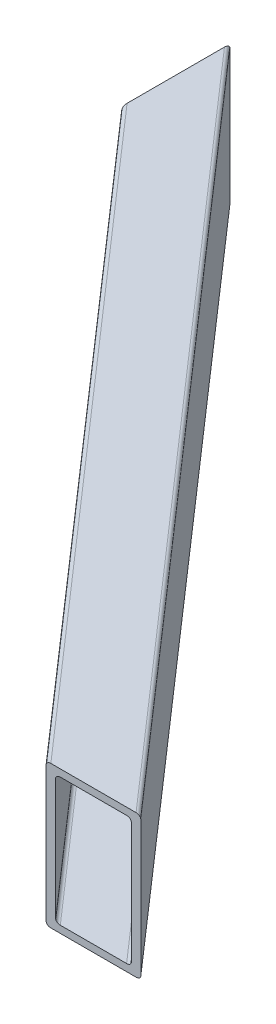
ISO-10303-21;
HEADER;
FILE_DESCRIPTION(('STEP AP214'),'2;1');
FILE_NAME('part.step','',(''),(''),'','','');
FILE_SCHEMA(('AUTOMOTIVE_DESIGN { 1 0 10303 214 1 1 1 1 }'));
ENDSEC;
DATA;
#1=APPLICATION_CONTEXT('core data for automotive mechanical design processes');
#2=APPLICATION_PROTOCOL_DEFINITION('international standard','automotive_design',2000,#1);
#3=PRODUCT_CONTEXT('',#1,'mechanical');
#4=PRODUCT('Part','Part','',(#3));
#5=PRODUCT_RELATED_PRODUCT_CATEGORY('part','',(#4));
#6=PRODUCT_DEFINITION_FORMATION('','',#4);
#7=PRODUCT_DEFINITION_CONTEXT('part definition',#1,'design');
#8=PRODUCT_DEFINITION('design','',#6,#7);
#9=PRODUCT_DEFINITION_SHAPE('','',#8);
#10=(LENGTH_UNIT() NAMED_UNIT(*) SI_UNIT(.MILLI.,.METRE.));
#11=(NAMED_UNIT(*) PLANE_ANGLE_UNIT() SI_UNIT($,.RADIAN.));
#12=(NAMED_UNIT(*) SI_UNIT($,.STERADIAN.) SOLID_ANGLE_UNIT());
#13=UNCERTAINTY_MEASURE_WITH_UNIT(LENGTH_MEASURE(1.E-05),#10,'distance_accuracy_value','');
#14=(GEOMETRIC_REPRESENTATION_CONTEXT(3) GLOBAL_UNCERTAINTY_ASSIGNED_CONTEXT((#13)) GLOBAL_UNIT_ASSIGNED_CONTEXT((#10,
#11,#12)) REPRESENTATION_CONTEXT('',''));
#15=CARTESIAN_POINT('',(0.,0.,0.));
#16=DIRECTION('',(0.,0.,1.));
#17=DIRECTION('',(1.,0.,0.));
#18=AXIS2_PLACEMENT_3D('',#15,#16,#17);
#19=CARTESIAN_POINT('',(0.,80.,-339.256309641516));
#20=DIRECTION('',(1.,0.,0.));
#21=DIRECTION('',(0.,0.,-1.));
#22=AXIS2_PLACEMENT_3D('',#19,#20,#21);
#23=PLANE('',#22);
#24=DIRECTION('',(0.,0.,-1.));
#25=VECTOR('',#24,1.);
#26=CARTESIAN_POINT('',(0.,4.,-339.256309641516));
#27=LINE('',#26,#25);
#28=CARTESIAN_POINT('',(0.,4.,-348.367863195289));
#29=VERTEX_POINT('',#28);
#30=CARTESIAN_POINT('',(0.,4.,-390.888446446227));
#31=VERTEX_POINT('',#30);
#32=EDGE_CURVE('E254',#29,#31,#27,.T.);
#33=ORIENTED_EDGE('',*,*,#32,.T.);
#34=CARTESIAN_POINT('',(0.,6.,-390.888446446227));
#35=DIRECTION('',(1.,0.,0.));
#36=DIRECTION('',(0.,0.,-1.));
#37=AXIS2_PLACEMENT_3D('',#34,#35,#36);
#38=ELLIPSE('',#37,3.03718451792419,2.);
#39=CARTESIAN_POINT('',(0.,6.00000000000001,-393.925630964152));
#40=VERTEX_POINT('',#39);
#41=EDGE_CURVE('E43',#31,#40,#38,.T.);
#42=ORIENTED_EDGE('',*,*,#41,.T.);
#43=DIRECTION('',(0.,1.,0.));
#44=VECTOR('',#43,1.);
#45=CARTESIAN_POINT('',(0.,80.,-393.925630964152));
#46=LINE('',#45,#44);
#47=CARTESIAN_POINT('',(0.,74.,-393.925630964152));
#48=VERTEX_POINT('',#47);
#49=EDGE_CURVE('E252',#40,#48,#46,.T.);
#50=ORIENTED_EDGE('',*,*,#49,.T.);
#51=CARTESIAN_POINT('',(0.,74.,-390.888446446227));
#52=DIRECTION('',(1.,0.,0.));
#53=DIRECTION('',(0.,0.,1.));
#54=AXIS2_PLACEMENT_3D('',#51,#52,#53);
#55=ELLIPSE('',#54,3.03718451792419,2.);
#56=CARTESIAN_POINT('',(0.,76.,-390.888446446227));
#57=VERTEX_POINT('',#56);
#58=EDGE_CURVE('E237',#48,#57,#55,.T.);
#59=ORIENTED_EDGE('',*,*,#58,.T.);
#60=DIRECTION('',(0.,0.,1.));
#61=VECTOR('',#60,1.);
#62=CARTESIAN_POINT('',(0.,76.,-339.256309641516));
#63=LINE('',#62,#61);
#64=CARTESIAN_POINT('',(0.,76.,-348.367863195289));
#65=VERTEX_POINT('',#64);
#66=EDGE_CURVE('E179',#57,#65,#63,.T.);
#67=ORIENTED_EDGE('',*,*,#66,.T.);
#68=CARTESIAN_POINT('',(0.,74.,-348.367863195289));
#69=DIRECTION('',(1.,0.,0.));
#70=DIRECTION('',(0.,0.,-1.));
#71=AXIS2_PLACEMENT_3D('',#68,#69,#70);
#72=ELLIPSE('',#71,3.03718451792418,2.);
#73=CARTESIAN_POINT('',(0.,74.,-345.330678677365));
#74=VERTEX_POINT('',#73);
#75=EDGE_CURVE('E243',#65,#74,#72,.T.);
#76=ORIENTED_EDGE('',*,*,#75,.T.);
#77=DIRECTION('',(0.,-1.,0.));
#78=VECTOR('',#77,1.);
#79=CARTESIAN_POINT('',(0.,80.,-345.330678677365));
#80=LINE('',#79,#78);
#81=CARTESIAN_POINT('',(0.,6.00000000000001,-345.330678677365));
#82=VERTEX_POINT('',#81);
#83=EDGE_CURVE('E277',#74,#82,#80,.T.);
#84=ORIENTED_EDGE('',*,*,#83,.T.);
#85=CARTESIAN_POINT('',(0.,6.,-348.367863195289));
#86=DIRECTION('',(1.,0.,0.));
#87=DIRECTION('',(0.,0.,1.));
#88=AXIS2_PLACEMENT_3D('',#85,#86,#87);
#89=ELLIPSE('',#88,3.03718451792418,2.);
#90=EDGE_CURVE('E247',#82,#29,#89,.T.);
#91=ORIENTED_EDGE('',*,*,#90,.T.);
#92=EDGE_LOOP('',(#33,#42,#50,#59,#67,#76,#84,#91));
#93=FACE_BOUND('',#92,.T.);
#94=DIRECTION('',(0.,-1.,0.));
#95=VECTOR('',#94,1.);
#96=CARTESIAN_POINT('',(0.,80.,-339.256309641516));
#97=LINE('',#96,#95);
#98=CARTESIAN_POINT('',(0.,78.,-339.256309641516));
#99=VERTEX_POINT('',#98);
#100=CARTESIAN_POINT('',(0.,2.,-339.256309641516));
#101=VERTEX_POINT('',#100);
#102=EDGE_CURVE('E167',#99,#101,#97,.T.);
#103=ORIENTED_EDGE('',*,*,#102,.F.);
#104=CARTESIAN_POINT('',(0.,78.,-342.29349415944));
#105=DIRECTION('',(1.,0.,0.));
#106=DIRECTION('',(0.,0.,1.));
#107=AXIS2_PLACEMENT_3D('',#104,#105,#106);
#108=ELLIPSE('',#107,3.03718451792418,2.);
#109=CARTESIAN_POINT('',(0.,80.,-342.29349415944));
#110=VERTEX_POINT('',#109);
#111=EDGE_CURVE('E154',#99,#110,#108,.F.);
#112=ORIENTED_EDGE('',*,*,#111,.T.);
#113=DIRECTION('',(0.,0.,1.));
#114=VECTOR('',#113,1.);
#115=CARTESIAN_POINT('',(0.,80.,-339.256309641516));
#116=LINE('',#115,#114);
#117=CARTESIAN_POINT('',(0.,80.,-396.962815482076));
#118=VERTEX_POINT('',#117);
#119=EDGE_CURVE('E162',#118,#110,#116,.T.);
#120=ORIENTED_EDGE('',*,*,#119,.F.);
#121=CARTESIAN_POINT('',(0.,78.,-396.962815482076));
#122=DIRECTION('',(1.,0.,0.));
#123=DIRECTION('',(0.,0.,-1.));
#124=AXIS2_PLACEMENT_3D('',#121,#122,#123);
#125=ELLIPSE('',#124,3.03718451792419,2.);
#126=CARTESIAN_POINT('',(0.,78.,-400.));
#127=VERTEX_POINT('',#126);
#128=EDGE_CURVE('E58',#118,#127,#125,.F.);
#129=ORIENTED_EDGE('',*,*,#128,.T.);
#130=DIRECTION('',(0.,-1.,0.));
#131=VECTOR('',#130,1.);
#132=CARTESIAN_POINT('',(0.,80.,-400.));
#133=LINE('',#132,#131);
#134=CARTESIAN_POINT('',(0.,2.,-400.));
#135=VERTEX_POINT('',#134);
#136=EDGE_CURVE('E173',#127,#135,#133,.T.);
#137=ORIENTED_EDGE('',*,*,#136,.T.);
#138=CARTESIAN_POINT('',(0.,2.,-396.962815482076));
#139=DIRECTION('',(1.,0.,0.));
#140=DIRECTION('',(0.,0.,1.));
#141=AXIS2_PLACEMENT_3D('',#138,#139,#140);
#142=ELLIPSE('',#141,3.03718451792419,2.);
#143=CARTESIAN_POINT('',(0.,0.,-396.962815482076));
#144=VERTEX_POINT('',#143);
#145=EDGE_CURVE('E50',#135,#144,#142,.F.);
#146=ORIENTED_EDGE('',*,*,#145,.T.);
#147=DIRECTION('',(0.,0.,1.));
#148=VECTOR('',#147,1.);
#149=CARTESIAN_POINT('',(0.,0.,-339.256309641516));
#150=LINE('',#149,#148);
#151=CARTESIAN_POINT('',(0.,0.,-342.29349415944));
#152=VERTEX_POINT('',#151);
#153=EDGE_CURVE('E176',#144,#152,#150,.T.);
#154=ORIENTED_EDGE('',*,*,#153,.T.);
#155=CARTESIAN_POINT('',(0.,2.,-342.29349415944));
#156=DIRECTION('',(1.,0.,0.));
#157=DIRECTION('',(0.,0.,-1.));
#158=AXIS2_PLACEMENT_3D('',#155,#156,#157);
#159=ELLIPSE('',#158,3.03718451792418,2.);
#160=EDGE_CURVE('E155',#152,#101,#159,.F.);
#161=ORIENTED_EDGE('',*,*,#160,.T.);
#162=EDGE_LOOP('',(#103,#112,#120,#129,#137,#146,#154,#161));
#163=FACE_BOUND('',#162,.T.);
#164=ADVANCED_FACE('F35',(#93,#163),#23,.F.);
#165=CARTESIAN_POINT('',(0.,80.,-339.256309641516));
#166=DIRECTION('',(0.752576694706878,0.,-0.658504607868518));
#167=DIRECTION('',(-0.658504607868518,0.,-0.752576694706878));
#168=AXIS2_PLACEMENT_3D('',#165,#166,#167);
#169=PLANE('',#168);
#170=DIRECTION('',(0.,-1.,0.));
#171=VECTOR('',#170,1.);
#172=CARTESIAN_POINT('',(296.849270936327,80.,0.));
#173=LINE('',#172,#171);
#174=CARTESIAN_POINT('',(296.849270936327,78.,0.));
#175=VERTEX_POINT('',#174);
#176=CARTESIAN_POINT('',(296.849270936327,2.,0.));
#177=VERTEX_POINT('',#176);
#178=EDGE_CURVE('E188',#175,#177,#173,.T.);
#179=ORIENTED_EDGE('',*,*,#178,.F.);
#180=DIRECTION('',(0.658504607868518,0.,0.752576694706878));
#181=VECTOR('',#180,1.);
#182=CARTESIAN_POINT('',(0.,78.,-339.256309641516));
#183=LINE('',#182,#181);
#184=EDGE_CURVE('E205',#175,#99,#183,.F.);
#185=ORIENTED_EDGE('',*,*,#184,.T.);
#186=ORIENTED_EDGE('',*,*,#102,.T.);
#187=DIRECTION('',(0.658504607868518,0.,0.752576694706878));
#188=VECTOR('',#187,1.);
#189=CARTESIAN_POINT('',(296.849270936327,2.,1.48039438822342E-13));
#190=LINE('',#189,#188);
#191=EDGE_CURVE('E202',#101,#177,#190,.T.);
#192=ORIENTED_EDGE('',*,*,#191,.T.);
#193=EDGE_LOOP('',(#179,#185,#186,#192));
#194=FACE_BOUND('',#193,.T.);
#195=ADVANCED_FACE('F316',(#194),#169,.F.);
#196=CARTESIAN_POINT('',(296.849270936327,80.,0.));
#197=DIRECTION('',(0.,0.,-1.));
#198=DIRECTION('',(-1.,0.,0.));
#199=AXIS2_PLACEMENT_3D('',#196,#197,#198);
#200=PLANE('',#199);
#201=DIRECTION('',(-1.,0.,0.));
#202=VECTOR('',#201,1.);
#203=CARTESIAN_POINT('',(296.849270936327,4.,0.));
#204=LINE('',#203,#202);
#205=CARTESIAN_POINT('',(342.027390640449,4.,0.));
#206=VERTEX_POINT('',#205);
#207=CARTESIAN_POINT('',(304.821880295878,4.,0.));
#208=VERTEX_POINT('',#207);
#209=EDGE_CURVE('E273',#206,#208,#204,.T.);
#210=ORIENTED_EDGE('',*,*,#209,.T.);
#211=CARTESIAN_POINT('',(304.821880295878,6.,0.));
#212=DIRECTION('',(0.,0.,-1.));
#213=DIRECTION('',(1.,0.,0.));
#214=AXIS2_PLACEMENT_3D('',#211,#212,#213);
#215=ELLIPSE('',#214,2.65753645318366,2.);
#216=CARTESIAN_POINT('',(302.164343842694,6.00000000000001,0.));
#217=VERTEX_POINT('',#216);
#218=EDGE_CURVE('E245',#208,#217,#215,.T.);
#219=ORIENTED_EDGE('',*,*,#218,.T.);
#220=DIRECTION('',(0.,1.,0.));
#221=VECTOR('',#220,1.);
#222=CARTESIAN_POINT('',(302.164343842694,80.,0.));
#223=LINE('',#222,#221);
#224=CARTESIAN_POINT('',(302.164343842694,74.,0.));
#225=VERTEX_POINT('',#224);
#226=EDGE_CURVE('E263',#217,#225,#223,.T.);
#227=ORIENTED_EDGE('',*,*,#226,.T.);
#228=CARTESIAN_POINT('',(304.821880295878,74.,0.));
#229=DIRECTION('',(0.,0.,-1.));
#230=DIRECTION('',(-1.,0.,0.));
#231=AXIS2_PLACEMENT_3D('',#228,#229,#230);
#232=ELLIPSE('',#231,2.65753645318366,2.);
#233=CARTESIAN_POINT('',(304.821880295878,76.,0.));
#234=VERTEX_POINT('',#233);
#235=EDGE_CURVE('E241',#225,#234,#232,.T.);
#236=ORIENTED_EDGE('',*,*,#235,.T.);
#237=DIRECTION('',(1.,0.,0.));
#238=VECTOR('',#237,1.);
#239=CARTESIAN_POINT('',(296.849270936327,76.,0.));
#240=LINE('',#239,#238);
#241=CARTESIAN_POINT('',(342.027390640449,76.,0.));
#242=VERTEX_POINT('',#241);
#243=EDGE_CURVE('E279',#234,#242,#240,.T.);
#244=ORIENTED_EDGE('',*,*,#243,.T.);
#245=CARTESIAN_POINT('',(342.027390640449,74.,0.));
#246=DIRECTION('',(0.,0.,-1.));
#247=DIRECTION('',(1.,0.,0.));
#248=AXIS2_PLACEMENT_3D('',#245,#246,#247);
#249=ELLIPSE('',#248,2.65753645318366,2.);
#250=CARTESIAN_POINT('',(344.684927093633,74.,0.));
#251=VERTEX_POINT('',#250);
#252=EDGE_CURVE('E239',#242,#251,#249,.T.);
#253=ORIENTED_EDGE('',*,*,#252,.T.);
#254=DIRECTION('',(0.,-1.,0.));
#255=VECTOR('',#254,1.);
#256=CARTESIAN_POINT('',(344.684927093633,80.,0.));
#257=LINE('',#256,#255);
#258=CARTESIAN_POINT('',(344.684927093633,6.00000000000001,0.));
#259=VERTEX_POINT('',#258);
#260=EDGE_CURVE('E264',#251,#259,#257,.T.);
#261=ORIENTED_EDGE('',*,*,#260,.T.);
#262=CARTESIAN_POINT('',(342.027390640449,6.,0.));
#263=DIRECTION('',(0.,0.,-1.));
#264=DIRECTION('',(-1.,0.,0.));
#265=AXIS2_PLACEMENT_3D('',#262,#263,#264);
#266=ELLIPSE('',#265,2.65753645318366,2.);
#267=EDGE_CURVE('E11',#259,#206,#266,.T.);
#268=ORIENTED_EDGE('',*,*,#267,.T.);
#269=EDGE_LOOP('',(#210,#219,#227,#236,#244,#253,#261,#268));
#270=FACE_BOUND('',#269,.T.);
#271=DIRECTION('',(1.,0.,0.));
#272=VECTOR('',#271,1.);
#273=CARTESIAN_POINT('',(296.849270936327,80.,0.));
#274=LINE('',#273,#272);
#275=CARTESIAN_POINT('',(299.50680738951,80.,0.));
#276=VERTEX_POINT('',#275);
#277=CARTESIAN_POINT('',(347.342463546816,80.,0.));
#278=VERTEX_POINT('',#277);
#279=EDGE_CURVE('E165',#276,#278,#274,.T.);
#280=ORIENTED_EDGE('',*,*,#279,.F.);
#281=CARTESIAN_POINT('',(299.50680738951,78.,0.));
#282=DIRECTION('',(0.,0.,-1.));
#283=DIRECTION('',(1.,0.,0.));
#284=AXIS2_PLACEMENT_3D('',#281,#282,#283);
#285=ELLIPSE('',#284,2.65753645318366,2.);
#286=EDGE_CURVE('E200',#276,#175,#285,.F.);
#287=ORIENTED_EDGE('',*,*,#286,.T.);
#288=ORIENTED_EDGE('',*,*,#178,.T.);
#289=CARTESIAN_POINT('',(299.50680738951,2.,0.));
#290=DIRECTION('',(0.,0.,-1.));
#291=DIRECTION('',(-1.,0.,0.));
#292=AXIS2_PLACEMENT_3D('',#289,#290,#291);
#293=ELLIPSE('',#292,2.65753645318366,2.);
#294=CARTESIAN_POINT('',(299.50680738951,0.,0.));
#295=VERTEX_POINT('',#294);
#296=EDGE_CURVE('E196',#177,#295,#293,.F.);
#297=ORIENTED_EDGE('',*,*,#296,.T.);
#298=DIRECTION('',(1.,0.,0.));
#299=VECTOR('',#298,1.);
#300=CARTESIAN_POINT('',(296.849270936327,0.,0.));
#301=LINE('',#300,#299);
#302=CARTESIAN_POINT('',(347.342463546816,0.,0.));
#303=VERTEX_POINT('',#302);
#304=EDGE_CURVE('E171',#295,#303,#301,.T.);
#305=ORIENTED_EDGE('',*,*,#304,.T.);
#306=CARTESIAN_POINT('',(347.342463546816,2.,0.));
#307=DIRECTION('',(0.,0.,-1.));
#308=DIRECTION('',(1.,0.,0.));
#309=AXIS2_PLACEMENT_3D('',#306,#307,#308);
#310=ELLIPSE('',#309,2.65753645318366,2.);
#311=CARTESIAN_POINT('',(350.,2.,0.));
#312=VERTEX_POINT('',#311);
#313=EDGE_CURVE('E194',#303,#312,#310,.F.);
#314=ORIENTED_EDGE('',*,*,#313,.T.);
#315=DIRECTION('',(0.,-1.,0.));
#316=VECTOR('',#315,1.);
#317=CARTESIAN_POINT('',(350.,80.,0.));
#318=LINE('',#317,#316);
#319=CARTESIAN_POINT('',(350.,78.,0.));
#320=VERTEX_POINT('',#319);
#321=EDGE_CURVE('E185',#320,#312,#318,.T.);
#322=ORIENTED_EDGE('',*,*,#321,.F.);
#323=CARTESIAN_POINT('',(347.342463546816,78.,0.));
#324=DIRECTION('',(0.,0.,-1.));
#325=DIRECTION('',(-1.,0.,0.));
#326=AXIS2_PLACEMENT_3D('',#323,#324,#325);
#327=ELLIPSE('',#326,2.65753645318366,2.);
#328=EDGE_CURVE('E198',#320,#278,#327,.F.);
#329=ORIENTED_EDGE('',*,*,#328,.T.);
#330=EDGE_LOOP('',(#280,#287,#288,#297,#305,#314,#322,#329));
#331=FACE_BOUND('',#330,.T.);
#332=ADVANCED_FACE('F271',(#270,#331),#200,.F.);
#333=CARTESIAN_POINT('',(350.,80.,0.));
#334=DIRECTION('',(-0.752576694706878,0.,0.658504607868518));
#335=DIRECTION('',(0.658504607868518,0.,0.752576694706878));
#336=AXIS2_PLACEMENT_3D('',#333,#334,#335);
#337=PLANE('',#336);
#338=ORIENTED_EDGE('',*,*,#136,.F.);
#339=DIRECTION('',(-0.658504607868518,0.,-0.752576694706878));
#340=VECTOR('',#339,1.);
#341=CARTESIAN_POINT('',(350.,78.,0.));
#342=LINE('',#341,#340);
#343=EDGE_CURVE('E153',#127,#320,#342,.F.);
#344=ORIENTED_EDGE('',*,*,#343,.T.);
#345=ORIENTED_EDGE('',*,*,#321,.T.);
#346=DIRECTION('',(-0.658504607868518,0.,-0.752576694706878));
#347=VECTOR('',#346,1.);
#348=CARTESIAN_POINT('',(0.,2.,-400.));
#349=LINE('',#348,#347);
#350=EDGE_CURVE('E230',#312,#135,#349,.T.);
#351=ORIENTED_EDGE('',*,*,#350,.T.);
#352=EDGE_LOOP('',(#338,#344,#345,#351));
#353=FACE_BOUND('',#352,.T.);
#354=ADVANCED_FACE('F391',(#353),#337,.F.);
#355=CARTESIAN_POINT('',(0.,80.,0.));
#356=DIRECTION('',(0.,-1.,0.));
#357=DIRECTION('',(0.,0.,-1.));
#358=AXIS2_PLACEMENT_3D('',#355,#356,#357);
#359=PLANE('',#358);
#360=ORIENTED_EDGE('',*,*,#119,.T.);
#361=DIRECTION('',(0.658504607868518,0.,0.752576694706878));
#362=VECTOR('',#361,1.);
#363=CARTESIAN_POINT('',(169.632174096714,80.,-148.428152334625));
#364=LINE('',#363,#362);
#365=EDGE_CURVE('E166',#110,#276,#364,.T.);
#366=ORIENTED_EDGE('',*,*,#365,.T.);
#367=ORIENTED_EDGE('',*,*,#279,.T.);
#368=DIRECTION('',(-0.658504607868518,0.,-0.752576694706878));
#369=VECTOR('',#368,1.);
#370=CARTESIAN_POINT('',(196.724935106161,80.,-172.134318217891));
#371=LINE('',#370,#369);
#372=EDGE_CURVE('E152',#278,#118,#371,.T.);
#373=ORIENTED_EDGE('',*,*,#372,.T.);
#374=EDGE_LOOP('',(#360,#366,#367,#373));
#375=FACE_BOUND('',#374,.T.);
#376=ADVANCED_FACE('F160',(#375),#359,.F.);
#377=CARTESIAN_POINT('',(0.,0.,0.));
#378=DIRECTION('',(0.,-1.,0.));
#379=DIRECTION('',(0.,0.,-1.));
#380=AXIS2_PLACEMENT_3D('',#377,#378,#379);
#381=PLANE('',#380);
#382=ORIENTED_EDGE('',*,*,#304,.F.);
#383=DIRECTION('',(0.658504607868518,0.,0.752576694706878));
#384=VECTOR('',#383,1.);
#385=CARTESIAN_POINT('',(1.50515338941375,0.,-340.573318857253));
#386=LINE('',#385,#384);
#387=EDGE_CURVE('E235',#295,#152,#386,.F.);
#388=ORIENTED_EDGE('',*,*,#387,.T.);
#389=ORIENTED_EDGE('',*,*,#153,.F.);
#390=DIRECTION('',(-0.658504607868518,0.,-0.752576694706878));
#391=VECTOR('',#390,1.);
#392=CARTESIAN_POINT('',(348.494846610586,0.,1.31700921573704));
#393=LINE('',#392,#391);
#394=EDGE_CURVE('E233',#144,#303,#393,.F.);
#395=ORIENTED_EDGE('',*,*,#394,.T.);
#396=EDGE_LOOP('',(#382,#388,#389,#395));
#397=FACE_BOUND('',#396,.T.);
#398=ADVANCED_FACE('F327',(#397),#381,.T.);
#399=CARTESIAN_POINT('',(3.01030677882751,80.,-341.89032807299));
#400=DIRECTION('',(0.752576694706878,0.,-0.658504607868518));
#401=DIRECTION('',(-0.658504607868518,0.,-0.752576694706878));
#402=AXIS2_PLACEMENT_3D('',#399,#400,#401);
#403=PLANE('',#402);
#404=ORIENTED_EDGE('',*,*,#83,.F.);
#405=DIRECTION('',(0.658504607868518,0.,0.752576694706878));
#406=VECTOR('',#405,1.);
#407=CARTESIAN_POINT('',(302.164343842694,74.,1.4810201676152E-13));
#408=LINE('',#407,#406);
#409=EDGE_CURVE('E221',#74,#225,#408,.T.);
#410=ORIENTED_EDGE('',*,*,#409,.T.);
#411=ORIENTED_EDGE('',*,*,#226,.F.);
#412=DIRECTION('',(0.658504607868518,0.,0.752576694706878));
#413=VECTOR('',#412,1.);
#414=CARTESIAN_POINT('',(3.01030677882751,6.00000000000001,-341.89032807299));
#415=LINE('',#414,#413);
#416=EDGE_CURVE('E219',#217,#82,#415,.F.);
#417=ORIENTED_EDGE('',*,*,#416,.T.);
#418=EDGE_LOOP('',(#404,#410,#411,#417));
#419=FACE_BOUND('',#418,.T.);
#420=ADVANCED_FACE('F300',(#419),#403,.T.);
#421=CARTESIAN_POINT('',(346.989693221172,80.,2.63401843147407));
#422=DIRECTION('',(-0.752576694706878,0.,0.658504607868518));
#423=DIRECTION('',(0.658504607868518,0.,0.752576694706878));
#424=AXIS2_PLACEMENT_3D('',#421,#422,#423);
#425=PLANE('',#424);
#426=ORIENTED_EDGE('',*,*,#260,.F.);
#427=DIRECTION('',(-0.658504607868518,0.,-0.752576694706878));
#428=VECTOR('',#427,1.);
#429=CARTESIAN_POINT('',(0.,74.,-393.925630964152));
#430=LINE('',#429,#428);
#431=EDGE_CURVE('E212',#251,#48,#430,.T.);
#432=ORIENTED_EDGE('',*,*,#431,.T.);
#433=ORIENTED_EDGE('',*,*,#49,.F.);
#434=DIRECTION('',(-0.658504607868518,0.,-0.752576694706878));
#435=VECTOR('',#434,1.);
#436=CARTESIAN_POINT('',(346.989693221172,6.00000000000001,2.63401843147407));
#437=LINE('',#436,#435);
#438=EDGE_CURVE('E210',#40,#259,#437,.F.);
#439=ORIENTED_EDGE('',*,*,#438,.T.);
#440=EDGE_LOOP('',(#426,#432,#433,#439));
#441=FACE_BOUND('',#440,.T.);
#442=ADVANCED_FACE('F260',(#441),#425,.T.);
#443=CARTESIAN_POINT('',(0.,76.,0.));
#444=DIRECTION('',(0.,-1.,0.));
#445=DIRECTION('',(0.,0.,-1.));
#446=AXIS2_PLACEMENT_3D('',#443,#444,#445);
#447=PLANE('',#446);
#448=ORIENTED_EDGE('',*,*,#66,.F.);
#449=DIRECTION('',(-0.658504607868518,0.,-0.752576694706878));
#450=VECTOR('',#449,1.);
#451=CARTESIAN_POINT('',(343.179773704219,76.,1.31700921573708));
#452=LINE('',#451,#450);
#453=EDGE_CURVE('E217',#57,#242,#452,.F.);
#454=ORIENTED_EDGE('',*,*,#453,.T.);
#455=ORIENTED_EDGE('',*,*,#243,.F.);
#456=DIRECTION('',(0.658504607868518,0.,0.752576694706878));
#457=VECTOR('',#456,1.);
#458=CARTESIAN_POINT('',(1.50515338941374,76.,-346.647687893102));
#459=LINE('',#458,#457);
#460=EDGE_CURVE('E215',#234,#65,#459,.F.);
#461=ORIENTED_EDGE('',*,*,#460,.T.);
#462=EDGE_LOOP('',(#448,#454,#455,#461));
#463=FACE_BOUND('',#462,.T.);
#464=ADVANCED_FACE('F330',(#463),#447,.T.);
#465=CARTESIAN_POINT('',(0.,4.,0.));
#466=DIRECTION('',(0.,-1.,0.));
#467=DIRECTION('',(0.,0.,-1.));
#468=AXIS2_PLACEMENT_3D('',#465,#466,#467);
#469=PLANE('',#468);
#470=ORIENTED_EDGE('',*,*,#32,.F.);
#471=DIRECTION('',(0.658504607868518,0.,0.752576694706878));
#472=VECTOR('',#471,1.);
#473=CARTESIAN_POINT('',(172.642480875541,4.,-151.062170766099));
#474=LINE('',#473,#472);
#475=EDGE_CURVE('E227',#29,#208,#474,.T.);
#476=ORIENTED_EDGE('',*,*,#475,.T.);
#477=ORIENTED_EDGE('',*,*,#209,.F.);
#478=DIRECTION('',(-0.658504607868518,0.,-0.752576694706878));
#479=VECTOR('',#478,1.);
#480=CARTESIAN_POINT('',(193.714628327334,4.,-169.500299786417));
#481=LINE('',#480,#479);
#482=EDGE_CURVE('E224',#206,#31,#481,.T.);
#483=ORIENTED_EDGE('',*,*,#482,.T.);
#484=EDGE_LOOP('',(#470,#476,#477,#483));
#485=FACE_BOUND('',#484,.T.);
#486=ADVANCED_FACE('F275',(#485),#469,.F.);
#487=CARTESIAN_POINT('',(169.632174096714,78.,-148.428152334625));
#488=DIRECTION('',(0.658504607868518,0.,0.752576694706878));
#489=DIRECTION('',(0.752576694706878,0.,-0.658504607868518));
#490=AXIS2_PLACEMENT_3D('',#487,#488,#489);
#491=CYLINDRICAL_SURFACE('',#490,2.);
#492=ORIENTED_EDGE('',*,*,#111,.F.);
#493=ORIENTED_EDGE('',*,*,#184,.F.);
#494=ORIENTED_EDGE('',*,*,#286,.F.);
#495=ORIENTED_EDGE('',*,*,#365,.F.);
#496=EDGE_LOOP('',(#492,#493,#494,#495));
#497=FACE_BOUND('',#496,.T.);
#498=ADVANCED_FACE('F335',(#497),#491,.T.);
#499=CARTESIAN_POINT('',(345.484539831759,74.,3.95102764721111));
#500=DIRECTION('',(0.658504607868518,0.,0.752576694706878));
#501=DIRECTION('',(0.752576694706878,0.,-0.658504607868518));
#502=AXIS2_PLACEMENT_3D('',#499,#500,#501);
#503=CYLINDRICAL_SURFACE('',#502,2.);
#504=ORIENTED_EDGE('',*,*,#252,.F.);
#505=ORIENTED_EDGE('',*,*,#453,.F.);
#506=ORIENTED_EDGE('',*,*,#58,.F.);
#507=ORIENTED_EDGE('',*,*,#431,.F.);
#508=EDGE_LOOP('',(#504,#505,#506,#507));
#509=FACE_BOUND('',#508,.T.);
#510=ADVANCED_FACE('F313',(#509),#503,.F.);
#511=CARTESIAN_POINT('',(4.51546016824127,74.,-343.207337288727));
#512=DIRECTION('',(-0.658504607868518,0.,-0.752576694706878));
#513=DIRECTION('',(-0.752576694706878,0.,0.658504607868518));
#514=AXIS2_PLACEMENT_3D('',#511,#512,#513);
#515=CYLINDRICAL_SURFACE('',#514,2.);
#516=ORIENTED_EDGE('',*,*,#75,.F.);
#517=ORIENTED_EDGE('',*,*,#460,.F.);
#518=ORIENTED_EDGE('',*,*,#235,.F.);
#519=ORIENTED_EDGE('',*,*,#409,.F.);
#520=EDGE_LOOP('',(#516,#517,#518,#519));
#521=FACE_BOUND('',#520,.T.);
#522=ADVANCED_FACE('F296',(#521),#515,.F.);
#523=CARTESIAN_POINT('',(172.642480875541,6.,-151.062170766099));
#524=DIRECTION('',(0.658504607868518,0.,0.752576694706878));
#525=DIRECTION('',(0.752576694706878,0.,-0.658504607868518));
#526=AXIS2_PLACEMENT_3D('',#523,#524,#525);
#527=CYLINDRICAL_SURFACE('',#526,2.);
#528=ORIENTED_EDGE('',*,*,#90,.F.);
#529=ORIENTED_EDGE('',*,*,#416,.F.);
#530=ORIENTED_EDGE('',*,*,#218,.F.);
#531=ORIENTED_EDGE('',*,*,#475,.F.);
#532=EDGE_LOOP('',(#528,#529,#530,#531));
#533=FACE_BOUND('',#532,.T.);
#534=ADVANCED_FACE('F305',(#533),#527,.F.);
#535=CARTESIAN_POINT('',(193.714628327334,6.,-169.500299786417));
#536=DIRECTION('',(-0.658504607868518,0.,-0.752576694706878));
#537=DIRECTION('',(-0.752576694706878,0.,0.658504607868518));
#538=AXIS2_PLACEMENT_3D('',#535,#536,#537);
#539=CYLINDRICAL_SURFACE('',#538,2.);
#540=ORIENTED_EDGE('',*,*,#267,.F.);
#541=ORIENTED_EDGE('',*,*,#438,.F.);
#542=ORIENTED_EDGE('',*,*,#41,.F.);
#543=ORIENTED_EDGE('',*,*,#482,.F.);
#544=EDGE_LOOP('',(#540,#541,#542,#543));
#545=FACE_BOUND('',#544,.T.);
#546=ADVANCED_FACE('F267',(#545),#539,.F.);
#547=CARTESIAN_POINT('',(196.724935106161,78.,-172.134318217891));
#548=DIRECTION('',(-0.658504607868518,0.,-0.752576694706878));
#549=DIRECTION('',(-0.752576694706878,0.,0.658504607868518));
#550=AXIS2_PLACEMENT_3D('',#547,#548,#549);
#551=CYLINDRICAL_SURFACE('',#550,2.);
#552=ORIENTED_EDGE('',*,*,#328,.F.);
#553=ORIENTED_EDGE('',*,*,#343,.F.);
#554=ORIENTED_EDGE('',*,*,#128,.F.);
#555=ORIENTED_EDGE('',*,*,#372,.F.);
#556=EDGE_LOOP('',(#552,#553,#554,#555));
#557=FACE_BOUND('',#556,.T.);
#558=ADVANCED_FACE('F151',(#557),#551,.T.);
#559=CARTESIAN_POINT('',(1.50515338941376,2.,-340.573318857253));
#560=DIRECTION('',(-0.658504607868518,0.,-0.752576694706878));
#561=DIRECTION('',(-0.752576694706878,0.,0.658504607868518));
#562=AXIS2_PLACEMENT_3D('',#559,#560,#561);
#563=CYLINDRICAL_SURFACE('',#562,2.);
#564=ORIENTED_EDGE('',*,*,#160,.F.);
#565=ORIENTED_EDGE('',*,*,#387,.F.);
#566=ORIENTED_EDGE('',*,*,#296,.F.);
#567=ORIENTED_EDGE('',*,*,#191,.F.);
#568=EDGE_LOOP('',(#564,#565,#566,#567));
#569=FACE_BOUND('',#568,.T.);
#570=ADVANCED_FACE('F368',(#569),#563,.T.);
#571=CARTESIAN_POINT('',(348.494846610586,2.,1.31700921573704));
#572=DIRECTION('',(0.658504607868518,0.,0.752576694706878));
#573=DIRECTION('',(0.752576694706878,0.,-0.658504607868518));
#574=AXIS2_PLACEMENT_3D('',#571,#572,#573);
#575=CYLINDRICAL_SURFACE('',#574,2.);
#576=ORIENTED_EDGE('',*,*,#313,.F.);
#577=ORIENTED_EDGE('',*,*,#394,.F.);
#578=ORIENTED_EDGE('',*,*,#145,.F.);
#579=ORIENTED_EDGE('',*,*,#350,.F.);
#580=EDGE_LOOP('',(#576,#577,#578,#579));
#581=FACE_BOUND('',#580,.T.);
#582=ADVANCED_FACE('F37',(#581),#575,.T.);
#583=CLOSED_SHELL('',(#164,#195,#332,#354,#376,#398,#420,#442,#464,#486,#498,#510,#522,#534,
#546,#558,#570,#582));
#584=MANIFOLD_SOLID_BREP('B2',#583);
#585=ADVANCED_BREP_SHAPE_REPRESENTATION('',(#18,#584),#14);
#586=SHAPE_DEFINITION_REPRESENTATION(#9,#585);
ENDSEC;
END-ISO-10303-21;
